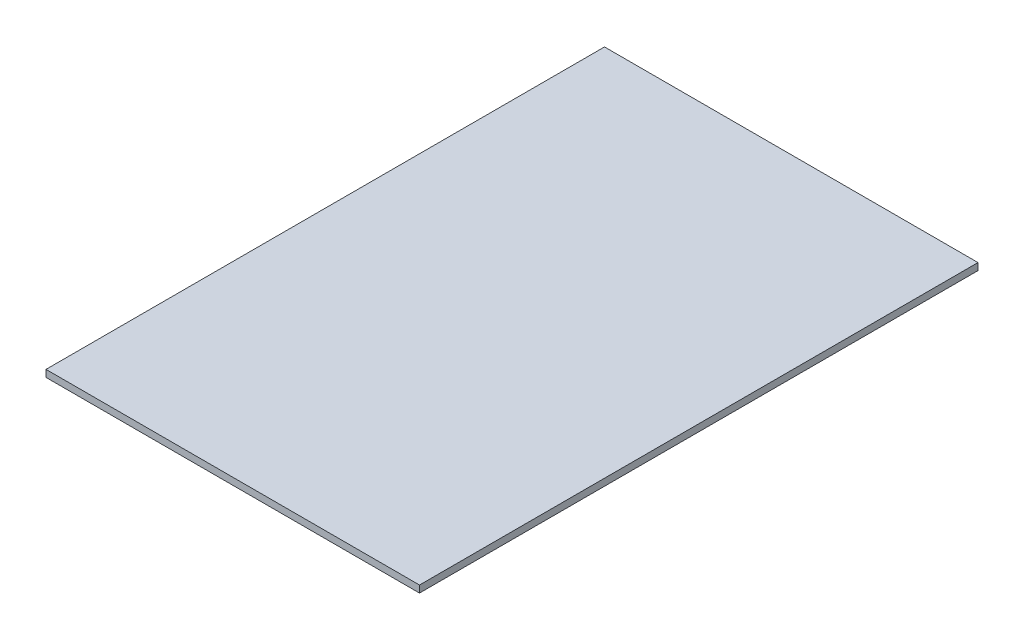
ISO-10303-21;
HEADER;
FILE_DESCRIPTION(('STEP AP214'),'2;1');
FILE_NAME('part.step','',(''),(''),'','','');
FILE_SCHEMA(('AUTOMOTIVE_DESIGN { 1 0 10303 214 1 1 1 1 }'));
ENDSEC;
DATA;
#1=APPLICATION_CONTEXT('core data for automotive mechanical design processes');
#2=APPLICATION_PROTOCOL_DEFINITION('international standard','automotive_design',2000,#1);
#3=PRODUCT_CONTEXT('',#1,'mechanical');
#4=PRODUCT('Part','Part','',(#3));
#5=PRODUCT_RELATED_PRODUCT_CATEGORY('part','',(#4));
#6=PRODUCT_DEFINITION_FORMATION('','',#4);
#7=PRODUCT_DEFINITION_CONTEXT('part definition',#1,'design');
#8=PRODUCT_DEFINITION('design','',#6,#7);
#9=PRODUCT_DEFINITION_SHAPE('','',#8);
#10=(LENGTH_UNIT() NAMED_UNIT(*) SI_UNIT(.MILLI.,.METRE.));
#11=(NAMED_UNIT(*) PLANE_ANGLE_UNIT() SI_UNIT($,.RADIAN.));
#12=(NAMED_UNIT(*) SI_UNIT($,.STERADIAN.) SOLID_ANGLE_UNIT());
#13=UNCERTAINTY_MEASURE_WITH_UNIT(LENGTH_MEASURE(1.E-05),#10,'distance_accuracy_value','');
#14=(GEOMETRIC_REPRESENTATION_CONTEXT(3) GLOBAL_UNCERTAINTY_ASSIGNED_CONTEXT((#13)) GLOBAL_UNIT_ASSIGNED_CONTEXT((#10,
#11,#12)) REPRESENTATION_CONTEXT('',''));
#15=CARTESIAN_POINT('',(0.,0.,0.));
#16=DIRECTION('',(0.,0.,1.));
#17=DIRECTION('',(1.,0.,0.));
#18=AXIS2_PLACEMENT_3D('',#15,#16,#17);
#19=CARTESIAN_POINT('',(0.,2.,0.));
#20=DIRECTION('',(-1.,0.,0.));
#21=DIRECTION('',(0.,0.,1.));
#22=AXIS2_PLACEMENT_3D('',#19,#20,#21);
#23=PLANE('',#22);
#24=DIRECTION('',(0.,0.,-1.));
#25=VECTOR('',#24,1.);
#26=CARTESIAN_POINT('',(0.,0.,0.));
#27=LINE('',#26,#25);
#28=CARTESIAN_POINT('',(0.,0.,160.));
#29=VERTEX_POINT('',#28);
#30=CARTESIAN_POINT('',(0.,0.,0.));
#31=VERTEX_POINT('',#30);
#32=EDGE_CURVE('E96',#29,#31,#27,.T.);
#33=ORIENTED_EDGE('',*,*,#32,.T.);
#34=DIRECTION('',(0.,-1.,0.));
#35=VECTOR('',#34,1.);
#36=CARTESIAN_POINT('',(0.,2.,0.));
#37=LINE('',#36,#35);
#38=CARTESIAN_POINT('',(0.,2.,0.));
#39=VERTEX_POINT('',#38);
#40=EDGE_CURVE('E11',#39,#31,#37,.T.);
#41=ORIENTED_EDGE('',*,*,#40,.F.);
#42=DIRECTION('',(0.,0.,-1.));
#43=VECTOR('',#42,1.);
#44=CARTESIAN_POINT('',(0.,2.,0.));
#45=LINE('',#44,#43);
#46=CARTESIAN_POINT('',(0.,2.,160.));
#47=VERTEX_POINT('',#46);
#48=EDGE_CURVE('E84',#47,#39,#45,.T.);
#49=ORIENTED_EDGE('',*,*,#48,.F.);
#50=DIRECTION('',(0.,-1.,0.));
#51=VECTOR('',#50,1.);
#52=CARTESIAN_POINT('',(0.,2.,160.));
#53=LINE('',#52,#51);
#54=EDGE_CURVE('E92',#47,#29,#53,.T.);
#55=ORIENTED_EDGE('',*,*,#54,.T.);
#56=EDGE_LOOP('',(#33,#41,#49,#55));
#57=FACE_BOUND('',#56,.T.);
#58=ADVANCED_FACE('F33',(#57),#23,.F.);
#59=CARTESIAN_POINT('',(0.,2.,0.));
#60=DIRECTION('',(0.,0.,1.));
#61=DIRECTION('',(1.,0.,0.));
#62=AXIS2_PLACEMENT_3D('',#59,#60,#61);
#63=PLANE('',#62);
#64=DIRECTION('',(-1.,0.,0.));
#65=VECTOR('',#64,1.);
#66=CARTESIAN_POINT('',(0.,0.,0.));
#67=LINE('',#66,#65);
#68=CARTESIAN_POINT('',(-107.,0.,0.));
#69=VERTEX_POINT('',#68);
#70=EDGE_CURVE('E88',#31,#69,#67,.T.);
#71=ORIENTED_EDGE('',*,*,#70,.T.);
#72=DIRECTION('',(0.,-1.,0.));
#73=VECTOR('',#72,1.);
#74=CARTESIAN_POINT('',(-107.,2.,0.));
#75=LINE('',#74,#73);
#76=CARTESIAN_POINT('',(-107.,2.,0.));
#77=VERTEX_POINT('',#76);
#78=EDGE_CURVE('E41',#77,#69,#75,.T.);
#79=ORIENTED_EDGE('',*,*,#78,.F.);
#80=DIRECTION('',(-1.,0.,0.));
#81=VECTOR('',#80,1.);
#82=CARTESIAN_POINT('',(0.,2.,0.));
#83=LINE('',#82,#81);
#84=EDGE_CURVE('E79',#39,#77,#83,.T.);
#85=ORIENTED_EDGE('',*,*,#84,.F.);
#86=ORIENTED_EDGE('',*,*,#40,.T.);
#87=EDGE_LOOP('',(#71,#79,#85,#86));
#88=FACE_BOUND('',#87,.T.);
#89=ADVANCED_FACE('F87',(#88),#63,.F.);
#90=CARTESIAN_POINT('',(-107.,2.,0.));
#91=DIRECTION('',(1.,0.,0.));
#92=DIRECTION('',(0.,0.,-1.));
#93=AXIS2_PLACEMENT_3D('',#90,#91,#92);
#94=PLANE('',#93);
#95=DIRECTION('',(0.,0.,1.));
#96=VECTOR('',#95,1.);
#97=CARTESIAN_POINT('',(-107.,0.,0.));
#98=LINE('',#97,#96);
#99=CARTESIAN_POINT('',(-107.,0.,160.));
#100=VERTEX_POINT('',#99);
#101=EDGE_CURVE('E66',#69,#100,#98,.T.);
#102=ORIENTED_EDGE('',*,*,#101,.T.);
#103=DIRECTION('',(0.,-1.,0.));
#104=VECTOR('',#103,1.);
#105=CARTESIAN_POINT('',(-107.,2.,160.));
#106=LINE('',#105,#104);
#107=CARTESIAN_POINT('',(-107.,2.,160.));
#108=VERTEX_POINT('',#107);
#109=EDGE_CURVE('E89',#108,#100,#106,.T.);
#110=ORIENTED_EDGE('',*,*,#109,.F.);
#111=DIRECTION('',(0.,0.,1.));
#112=VECTOR('',#111,1.);
#113=CARTESIAN_POINT('',(-107.,2.,0.));
#114=LINE('',#113,#112);
#115=EDGE_CURVE('E82',#77,#108,#114,.T.);
#116=ORIENTED_EDGE('',*,*,#115,.F.);
#117=ORIENTED_EDGE('',*,*,#78,.T.);
#118=EDGE_LOOP('',(#102,#110,#116,#117));
#119=FACE_BOUND('',#118,.T.);
#120=ADVANCED_FACE('F90',(#119),#94,.F.);
#121=CARTESIAN_POINT('',(0.,2.,160.));
#122=DIRECTION('',(0.,0.,-1.));
#123=DIRECTION('',(-1.,0.,0.));
#124=AXIS2_PLACEMENT_3D('',#121,#122,#123);
#125=PLANE('',#124);
#126=DIRECTION('',(1.,0.,0.));
#127=VECTOR('',#126,1.);
#128=CARTESIAN_POINT('',(0.,0.,160.));
#129=LINE('',#128,#127);
#130=EDGE_CURVE('E72',#100,#29,#129,.T.);
#131=ORIENTED_EDGE('',*,*,#130,.T.);
#132=ORIENTED_EDGE('',*,*,#54,.F.);
#133=DIRECTION('',(1.,0.,0.));
#134=VECTOR('',#133,1.);
#135=CARTESIAN_POINT('',(0.,2.,160.));
#136=LINE('',#135,#134);
#137=EDGE_CURVE('E49',#108,#47,#136,.T.);
#138=ORIENTED_EDGE('',*,*,#137,.F.);
#139=ORIENTED_EDGE('',*,*,#109,.T.);
#140=EDGE_LOOP('',(#131,#132,#138,#139));
#141=FACE_BOUND('',#140,.T.);
#142=ADVANCED_FACE('F103',(#141),#125,.F.);
#143=CARTESIAN_POINT('',(0.,2.,0.));
#144=DIRECTION('',(0.,-1.,0.));
#145=DIRECTION('',(0.,0.,-1.));
#146=AXIS2_PLACEMENT_3D('',#143,#144,#145);
#147=PLANE('',#146);
#148=ORIENTED_EDGE('',*,*,#48,.T.);
#149=ORIENTED_EDGE('',*,*,#84,.T.);
#150=ORIENTED_EDGE('',*,*,#115,.T.);
#151=ORIENTED_EDGE('',*,*,#137,.T.);
#152=EDGE_LOOP('',(#148,#149,#150,#151));
#153=FACE_BOUND('',#152,.T.);
#154=ADVANCED_FACE('F80',(#153),#147,.F.);
#155=CARTESIAN_POINT('',(0.,0.,0.));
#156=DIRECTION('',(0.,-1.,0.));
#157=DIRECTION('',(0.,0.,-1.));
#158=AXIS2_PLACEMENT_3D('',#155,#156,#157);
#159=PLANE('',#158);
#160=ORIENTED_EDGE('',*,*,#32,.F.);
#161=ORIENTED_EDGE('',*,*,#130,.F.);
#162=ORIENTED_EDGE('',*,*,#101,.F.);
#163=ORIENTED_EDGE('',*,*,#70,.F.);
#164=EDGE_LOOP('',(#160,#161,#162,#163));
#165=FACE_BOUND('',#164,.T.);
#166=ADVANCED_FACE('F106',(#165),#159,.T.);
#167=CLOSED_SHELL('',(#58,#89,#120,#142,#154,#166));
#168=MANIFOLD_SOLID_BREP('B2',#167);
#169=ADVANCED_BREP_SHAPE_REPRESENTATION('',(#18,#168),#14);
#170=SHAPE_DEFINITION_REPRESENTATION(#9,#169);
ENDSEC;
END-ISO-10303-21;
